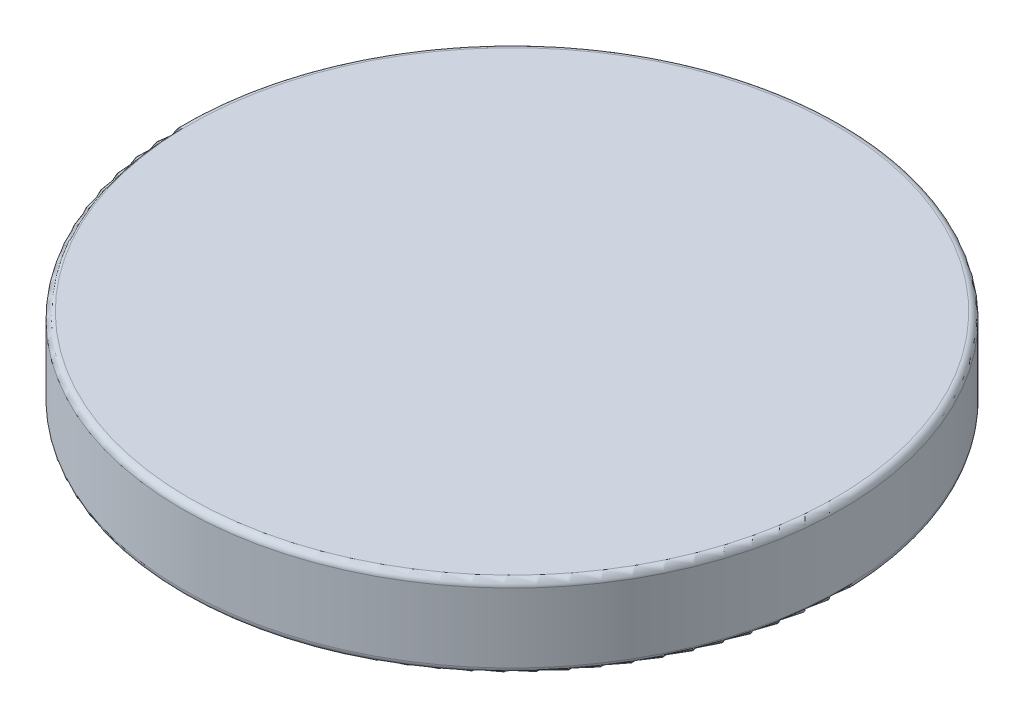
ISO-10303-21;
HEADER;
FILE_DESCRIPTION(('STEP AP214'),'2;1');
FILE_NAME('part.step','',(''),(''),'','','');
FILE_SCHEMA(('AUTOMOTIVE_DESIGN { 1 0 10303 214 1 1 1 1 }'));
ENDSEC;
DATA;
#1=APPLICATION_CONTEXT('core data for automotive mechanical design processes');
#2=APPLICATION_PROTOCOL_DEFINITION('international standard','automotive_design',2000,#1);
#3=PRODUCT_CONTEXT('',#1,'mechanical');
#4=PRODUCT('Part','Part','',(#3));
#5=PRODUCT_RELATED_PRODUCT_CATEGORY('part','',(#4));
#6=PRODUCT_DEFINITION_FORMATION('','',#4);
#7=PRODUCT_DEFINITION_CONTEXT('part definition',#1,'design');
#8=PRODUCT_DEFINITION('design','',#6,#7);
#9=PRODUCT_DEFINITION_SHAPE('','',#8);
#10=(LENGTH_UNIT() NAMED_UNIT(*) SI_UNIT(.MILLI.,.METRE.));
#11=(NAMED_UNIT(*) PLANE_ANGLE_UNIT() SI_UNIT($,.RADIAN.));
#12=(NAMED_UNIT(*) SI_UNIT($,.STERADIAN.) SOLID_ANGLE_UNIT());
#13=UNCERTAINTY_MEASURE_WITH_UNIT(LENGTH_MEASURE(1.E-05),#10,'distance_accuracy_value','');
#14=(GEOMETRIC_REPRESENTATION_CONTEXT(3) GLOBAL_UNCERTAINTY_ASSIGNED_CONTEXT((#13)) GLOBAL_UNIT_ASSIGNED_CONTEXT((#10,
#11,#12)) REPRESENTATION_CONTEXT('',''));
#15=CARTESIAN_POINT('',(0.,0.,0.));
#16=DIRECTION('',(0.,0.,1.));
#17=DIRECTION('',(1.,0.,0.));
#18=AXIS2_PLACEMENT_3D('',#15,#16,#17);
#19=CARTESIAN_POINT('',(0.,3.175,-1.66094448235299));
#20=DIRECTION('',(0.,-1.,0.));
#21=DIRECTION('',(0.,0.,-1.));
#22=AXIS2_PLACEMENT_3D('',#19,#20,#21);
#23=CYLINDRICAL_SURFACE('',#22,12.7);
#24=CARTESIAN_POINT('',(0.,0.254,-1.66094448235299));
#25=DIRECTION('',(0.,1.,0.));
#26=DIRECTION('',(0.,0.,1.));
#27=AXIS2_PLACEMENT_3D('',#24,#25,#26);
#28=CIRCLE('',#27,12.7);
#29=CARTESIAN_POINT('',(0.,0.254,11.039055517647));
#30=VERTEX_POINT('',#29);
#31=EDGE_CURVE('E50',#30,#30,#28,.T.);
#32=ORIENTED_EDGE('',*,*,#31,.T.);
#33=EDGE_LOOP('',(#32));
#34=FACE_BOUND('',#33,.T.);
#35=CARTESIAN_POINT('',(0.,2.921,-1.66094448235299));
#36=DIRECTION('',(0.,1.,0.));
#37=DIRECTION('',(0.,0.,1.));
#38=AXIS2_PLACEMENT_3D('',#35,#36,#37);
#39=CIRCLE('',#38,12.7);
#40=CARTESIAN_POINT('',(0.,2.921,11.039055517647));
#41=VERTEX_POINT('',#40);
#42=EDGE_CURVE('E55',#41,#41,#39,.F.);
#43=ORIENTED_EDGE('',*,*,#42,.T.);
#44=EDGE_LOOP('',(#43));
#45=FACE_BOUND('',#44,.T.);
#46=ADVANCED_FACE('F37',(#34,#45),#23,.T.);
#47=CARTESIAN_POINT('',(0.,3.175,-1.66094448235299));
#48=DIRECTION('',(0.,1.,0.));
#49=DIRECTION('',(0.,0.,1.));
#50=AXIS2_PLACEMENT_3D('',#47,#48,#49);
#51=PLANE('',#50);
#52=CARTESIAN_POINT('',(0.,3.175,-1.66094448235299));
#53=DIRECTION('',(0.,1.,0.));
#54=DIRECTION('',(0.,0.,1.));
#55=AXIS2_PLACEMENT_3D('',#52,#53,#54);
#56=CIRCLE('',#55,12.446);
#57=CARTESIAN_POINT('',(0.,3.175,10.785055517647));
#58=VERTEX_POINT('',#57);
#59=EDGE_CURVE('E10',#58,#58,#56,.T.);
#60=ORIENTED_EDGE('',*,*,#59,.T.);
#61=EDGE_LOOP('',(#60));
#62=FACE_BOUND('',#61,.T.);
#63=ADVANCED_FACE('F72',(#62),#51,.T.);
#64=CARTESIAN_POINT('',(0.,0.,-1.66094448235299));
#65=DIRECTION('',(0.,1.,0.));
#66=DIRECTION('',(0.,0.,1.));
#67=AXIS2_PLACEMENT_3D('',#64,#65,#66);
#68=PLANE('',#67);
#69=CARTESIAN_POINT('',(0.,0.,-1.66094448235299));
#70=DIRECTION('',(0.,1.,0.));
#71=DIRECTION('',(0.,0.,1.));
#72=AXIS2_PLACEMENT_3D('',#69,#70,#71);
#73=CIRCLE('',#72,12.446);
#74=CARTESIAN_POINT('',(0.,0.,10.785055517647));
#75=VERTEX_POINT('',#74);
#76=EDGE_CURVE('E45',#75,#75,#73,.F.);
#77=ORIENTED_EDGE('',*,*,#76,.T.);
#78=EDGE_LOOP('',(#77));
#79=FACE_BOUND('',#78,.T.);
#80=ADVANCED_FACE('F69',(#79),#68,.F.);
#81=CARTESIAN_POINT('',(0.,0.254,-1.66094448235299));
#82=DIRECTION('',(0.,1.,0.));
#83=DIRECTION('',(0.,0.,1.));
#84=AXIS2_PLACEMENT_3D('',#81,#82,#83);
#85=TOROIDAL_SURFACE('',#84,12.446,0.254);
#86=ORIENTED_EDGE('',*,*,#76,.F.);
#87=EDGE_LOOP('',(#86));
#88=FACE_BOUND('',#87,.T.);
#89=ORIENTED_EDGE('',*,*,#31,.F.);
#90=EDGE_LOOP('',(#89));
#91=FACE_BOUND('',#90,.T.);
#92=ADVANCED_FACE('F65',(#88,#91),#85,.T.);
#93=CARTESIAN_POINT('',(0.,2.921,-1.66094448235299));
#94=DIRECTION('',(0.,1.,0.));
#95=DIRECTION('',(0.,0.,1.));
#96=AXIS2_PLACEMENT_3D('',#93,#94,#95);
#97=TOROIDAL_SURFACE('',#96,12.446,0.254);
#98=ORIENTED_EDGE('',*,*,#42,.F.);
#99=EDGE_LOOP('',(#98));
#100=FACE_BOUND('',#99,.T.);
#101=ORIENTED_EDGE('',*,*,#59,.F.);
#102=EDGE_LOOP('',(#101));
#103=FACE_BOUND('',#102,.T.);
#104=ADVANCED_FACE('F39',(#100,#103),#97,.T.);
#105=CLOSED_SHELL('',(#46,#63,#80,#92,#104));
#106=MANIFOLD_SOLID_BREP('B2',#105);
#107=ADVANCED_BREP_SHAPE_REPRESENTATION('',(#18,#106),#14);
#108=SHAPE_DEFINITION_REPRESENTATION(#9,#107);
ENDSEC;
END-ISO-10303-21;
